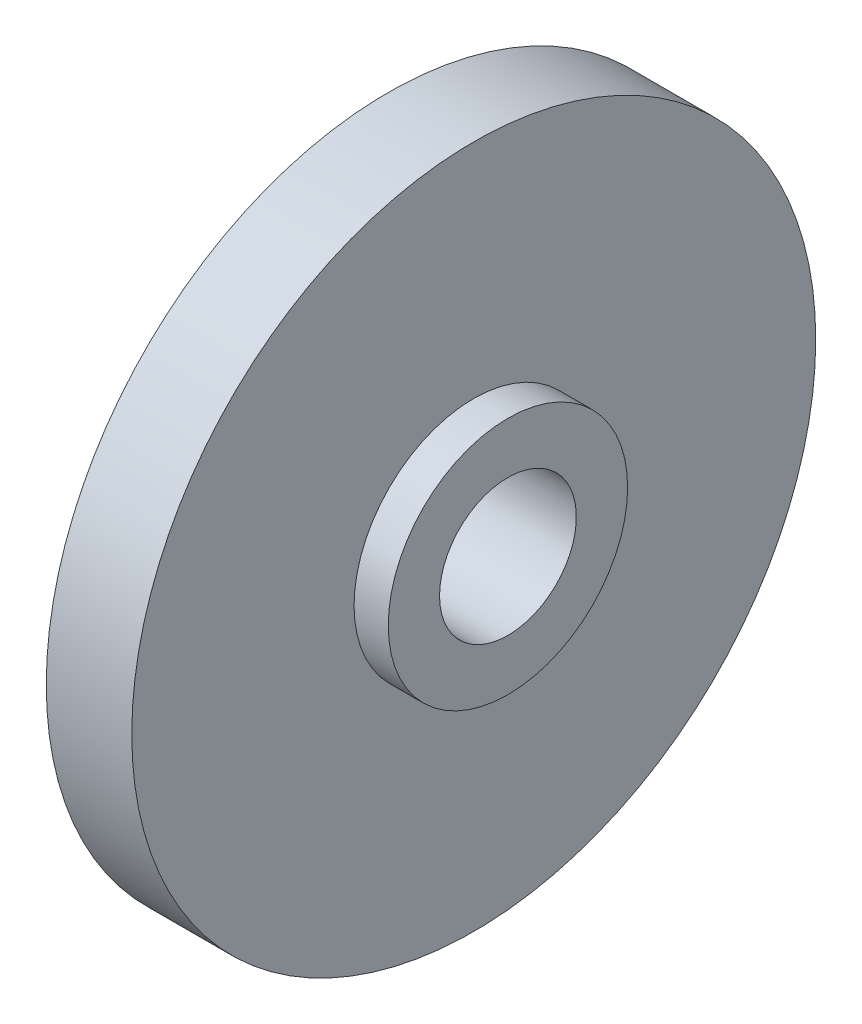
ISO-10303-21;
HEADER;
FILE_DESCRIPTION(('STEP AP214'),'2;1');
FILE_NAME('part.step','',(''),(''),'','','');
FILE_SCHEMA(('AUTOMOTIVE_DESIGN { 1 0 10303 214 1 1 1 1 }'));
ENDSEC;
DATA;
#1=APPLICATION_CONTEXT('core data for automotive mechanical design processes');
#2=APPLICATION_PROTOCOL_DEFINITION('international standard','automotive_design',2000,#1);
#3=PRODUCT_CONTEXT('',#1,'mechanical');
#4=PRODUCT('Part','Part','',(#3));
#5=PRODUCT_RELATED_PRODUCT_CATEGORY('part','',(#4));
#6=PRODUCT_DEFINITION_FORMATION('','',#4);
#7=PRODUCT_DEFINITION_CONTEXT('part definition',#1,'design');
#8=PRODUCT_DEFINITION('design','',#6,#7);
#9=PRODUCT_DEFINITION_SHAPE('','',#8);
#10=(LENGTH_UNIT() NAMED_UNIT(*) SI_UNIT(.MILLI.,.METRE.));
#11=(NAMED_UNIT(*) PLANE_ANGLE_UNIT() SI_UNIT($,.RADIAN.));
#12=(NAMED_UNIT(*) SI_UNIT($,.STERADIAN.) SOLID_ANGLE_UNIT());
#13=UNCERTAINTY_MEASURE_WITH_UNIT(LENGTH_MEASURE(1.E-05),#10,'distance_accuracy_value','');
#14=(GEOMETRIC_REPRESENTATION_CONTEXT(3) GLOBAL_UNCERTAINTY_ASSIGNED_CONTEXT((#13)) GLOBAL_UNIT_ASSIGNED_CONTEXT((#10,
#11,#12)) REPRESENTATION_CONTEXT('',''));
#15=CARTESIAN_POINT('',(0.,0.,0.));
#16=DIRECTION('',(0.,0.,1.));
#17=DIRECTION('',(1.,0.,0.));
#18=AXIS2_PLACEMENT_3D('',#15,#16,#17);
#19=CARTESIAN_POINT('',(5.,20.,0.));
#20=DIRECTION('',(-1.,0.,0.));
#21=DIRECTION('',(0.,0.,1.));
#22=AXIS2_PLACEMENT_3D('',#19,#20,#21);
#23=PLANE('',#22);
#24=CARTESIAN_POINT('',(5.,0.,0.));
#25=DIRECTION('',(-1.,0.,0.));
#26=DIRECTION('',(0.,0.,1.));
#27=AXIS2_PLACEMENT_3D('',#24,#25,#26);
#28=CIRCLE('',#27,20.);
#29=CARTESIAN_POINT('',(5.,0.,20.));
#30=VERTEX_POINT('',#29);
#31=EDGE_CURVE('E10',#30,#30,#28,.T.);
#32=ORIENTED_EDGE('',*,*,#31,.F.);
#33=EDGE_LOOP('',(#32));
#34=FACE_BOUND('',#33,.T.);
#35=CARTESIAN_POINT('',(5.,0.,0.));
#36=DIRECTION('',(-1.,0.,0.));
#37=DIRECTION('',(0.,0.,1.));
#38=AXIS2_PLACEMENT_3D('',#35,#36,#37);
#39=CIRCLE('',#38,7.);
#40=CARTESIAN_POINT('',(5.,0.,7.));
#41=VERTEX_POINT('',#40);
#42=EDGE_CURVE('E64',#41,#41,#39,.T.);
#43=ORIENTED_EDGE('',*,*,#42,.T.);
#44=EDGE_LOOP('',(#43));
#45=FACE_BOUND('',#44,.T.);
#46=ADVANCED_FACE('F37',(#34,#45),#23,.F.);
#47=CARTESIAN_POINT('',(0.,0.,0.));
#48=DIRECTION('',(-1.,0.,0.));
#49=DIRECTION('',(0.,0.,1.));
#50=AXIS2_PLACEMENT_3D('',#47,#48,#49);
#51=CYLINDRICAL_SURFACE('',#50,20.);
#52=CARTESIAN_POINT('',(0.,0.,0.));
#53=DIRECTION('',(-1.,0.,0.));
#54=DIRECTION('',(0.,0.,1.));
#55=AXIS2_PLACEMENT_3D('',#52,#53,#54);
#56=CIRCLE('',#55,20.);
#57=CARTESIAN_POINT('',(0.,0.,20.));
#58=VERTEX_POINT('',#57);
#59=EDGE_CURVE('E44',#58,#58,#56,.T.);
#60=ORIENTED_EDGE('',*,*,#59,.F.);
#61=EDGE_LOOP('',(#60));
#62=FACE_BOUND('',#61,.T.);
#63=ORIENTED_EDGE('',*,*,#31,.T.);
#64=EDGE_LOOP('',(#63));
#65=FACE_BOUND('',#64,.T.);
#66=ADVANCED_FACE('F90',(#62,#65),#51,.T.);
#67=CARTESIAN_POINT('',(0.,4.,0.));
#68=DIRECTION('',(1.,0.,0.));
#69=DIRECTION('',(0.,0.,-1.));
#70=AXIS2_PLACEMENT_3D('',#67,#68,#69);
#71=PLANE('',#70);
#72=CARTESIAN_POINT('',(0.,0.,0.));
#73=DIRECTION('',(-1.,0.,0.));
#74=DIRECTION('',(0.,0.,1.));
#75=AXIS2_PLACEMENT_3D('',#72,#73,#74);
#76=CIRCLE('',#75,4.);
#77=CARTESIAN_POINT('',(0.,0.,4.));
#78=VERTEX_POINT('',#77);
#79=EDGE_CURVE('E49',#78,#78,#76,.T.);
#80=ORIENTED_EDGE('',*,*,#79,.F.);
#81=EDGE_LOOP('',(#80));
#82=FACE_BOUND('',#81,.T.);
#83=ORIENTED_EDGE('',*,*,#59,.T.);
#84=EDGE_LOOP('',(#83));
#85=FACE_BOUND('',#84,.T.);
#86=ADVANCED_FACE('F85',(#82,#85),#71,.F.);
#87=CARTESIAN_POINT('',(0.,0.,0.));
#88=DIRECTION('',(-1.,0.,0.));
#89=DIRECTION('',(0.,0.,1.));
#90=AXIS2_PLACEMENT_3D('',#87,#88,#89);
#91=CYLINDRICAL_SURFACE('',#90,4.);
#92=CARTESIAN_POINT('',(7.,0.,0.));
#93=DIRECTION('',(-1.,0.,0.));
#94=DIRECTION('',(0.,0.,1.));
#95=AXIS2_PLACEMENT_3D('',#92,#93,#94);
#96=CIRCLE('',#95,4.);
#97=CARTESIAN_POINT('',(7.,0.,4.));
#98=VERTEX_POINT('',#97);
#99=EDGE_CURVE('E54',#98,#98,#96,.T.);
#100=ORIENTED_EDGE('',*,*,#99,.F.);
#101=EDGE_LOOP('',(#100));
#102=FACE_BOUND('',#101,.T.);
#103=ORIENTED_EDGE('',*,*,#79,.T.);
#104=EDGE_LOOP('',(#103));
#105=FACE_BOUND('',#104,.T.);
#106=ADVANCED_FACE('F79',(#102,#105),#91,.F.);
#107=CARTESIAN_POINT('',(7.,7.,0.));
#108=DIRECTION('',(-1.,0.,0.));
#109=DIRECTION('',(0.,0.,1.));
#110=AXIS2_PLACEMENT_3D('',#107,#108,#109);
#111=PLANE('',#110);
#112=CARTESIAN_POINT('',(7.,0.,0.));
#113=DIRECTION('',(-1.,0.,0.));
#114=DIRECTION('',(0.,0.,1.));
#115=AXIS2_PLACEMENT_3D('',#112,#113,#114);
#116=CIRCLE('',#115,7.);
#117=CARTESIAN_POINT('',(7.,0.,7.));
#118=VERTEX_POINT('',#117);
#119=EDGE_CURVE('E60',#118,#118,#116,.T.);
#120=ORIENTED_EDGE('',*,*,#119,.F.);
#121=EDGE_LOOP('',(#120));
#122=FACE_BOUND('',#121,.T.);
#123=ORIENTED_EDGE('',*,*,#99,.T.);
#124=EDGE_LOOP('',(#123));
#125=FACE_BOUND('',#124,.T.);
#126=ADVANCED_FACE('F73',(#122,#125),#111,.F.);
#127=CARTESIAN_POINT('',(0.,0.,0.));
#128=DIRECTION('',(-1.,0.,0.));
#129=DIRECTION('',(0.,0.,1.));
#130=AXIS2_PLACEMENT_3D('',#127,#128,#129);
#131=CYLINDRICAL_SURFACE('',#130,7.);
#132=ORIENTED_EDGE('',*,*,#42,.F.);
#133=EDGE_LOOP('',(#132));
#134=FACE_BOUND('',#133,.T.);
#135=ORIENTED_EDGE('',*,*,#119,.T.);
#136=EDGE_LOOP('',(#135));
#137=FACE_BOUND('',#136,.T.);
#138=ADVANCED_FACE('F70',(#134,#137),#131,.T.);
#139=CLOSED_SHELL('',(#46,#66,#86,#106,#126,#138));
#140=MANIFOLD_SOLID_BREP('B2',#139);
#141=ADVANCED_BREP_SHAPE_REPRESENTATION('',(#18,#140),#14);
#142=SHAPE_DEFINITION_REPRESENTATION(#9,#141);
ENDSEC;
END-ISO-10303-21;
